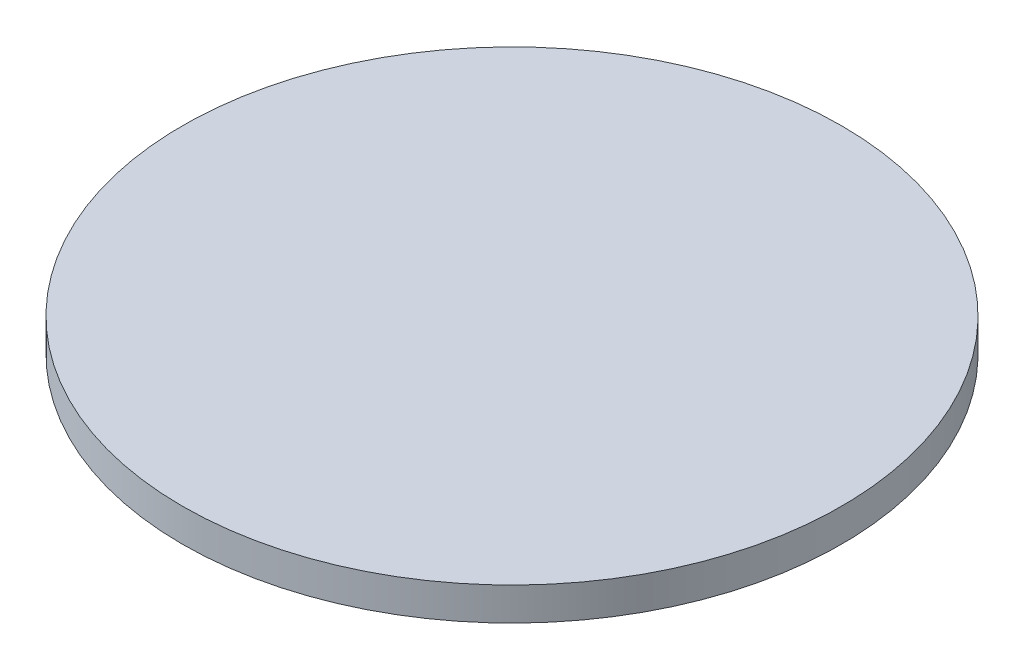
ISO-10303-21;
HEADER;
FILE_DESCRIPTION(('STEP AP214'),'2;1');
FILE_NAME('part.step','',(''),(''),'','','');
FILE_SCHEMA(('AUTOMOTIVE_DESIGN { 1 0 10303 214 1 1 1 1 }'));
ENDSEC;
DATA;
#1=APPLICATION_CONTEXT('core data for automotive mechanical design processes');
#2=APPLICATION_PROTOCOL_DEFINITION('international standard','automotive_design',2000,#1);
#3=PRODUCT_CONTEXT('',#1,'mechanical');
#4=PRODUCT('Part','Part','',(#3));
#5=PRODUCT_RELATED_PRODUCT_CATEGORY('part','',(#4));
#6=PRODUCT_DEFINITION_FORMATION('','',#4);
#7=PRODUCT_DEFINITION_CONTEXT('part definition',#1,'design');
#8=PRODUCT_DEFINITION('design','',#6,#7);
#9=PRODUCT_DEFINITION_SHAPE('','',#8);
#10=(LENGTH_UNIT() NAMED_UNIT(*) SI_UNIT(.MILLI.,.METRE.));
#11=(NAMED_UNIT(*) PLANE_ANGLE_UNIT() SI_UNIT($,.RADIAN.));
#12=(NAMED_UNIT(*) SI_UNIT($,.STERADIAN.) SOLID_ANGLE_UNIT());
#13=UNCERTAINTY_MEASURE_WITH_UNIT(LENGTH_MEASURE(1.E-05),#10,'distance_accuracy_value','');
#14=(GEOMETRIC_REPRESENTATION_CONTEXT(3) GLOBAL_UNCERTAINTY_ASSIGNED_CONTEXT((#13)) GLOBAL_UNIT_ASSIGNED_CONTEXT((#10,
#11,#12)) REPRESENTATION_CONTEXT('',''));
#15=CARTESIAN_POINT('',(0.,0.,0.));
#16=DIRECTION('',(0.,0.,1.));
#17=DIRECTION('',(1.,0.,0.));
#18=AXIS2_PLACEMENT_3D('',#15,#16,#17);
#19=CARTESIAN_POINT('',(0.,3.,0.));
#20=DIRECTION('',(0.,-1.,0.));
#21=DIRECTION('',(0.,0.,-1.));
#22=AXIS2_PLACEMENT_3D('',#19,#20,#21);
#23=CYLINDRICAL_SURFACE('',#22,30.);
#24=CARTESIAN_POINT('',(0.,3.,0.));
#25=DIRECTION('',(0.,1.,0.));
#26=DIRECTION('',(0.,0.,1.));
#27=AXIS2_PLACEMENT_3D('',#24,#25,#26);
#28=CIRCLE('',#27,30.);
#29=CARTESIAN_POINT('',(0.,3.,30.));
#30=VERTEX_POINT('',#29);
#31=EDGE_CURVE('E10',#30,#30,#28,.T.);
#32=ORIENTED_EDGE('',*,*,#31,.F.);
#33=EDGE_LOOP('',(#32));
#34=FACE_BOUND('',#33,.T.);
#35=CARTESIAN_POINT('',(0.,0.,0.));
#36=DIRECTION('',(0.,1.,0.));
#37=DIRECTION('',(0.,0.,1.));
#38=AXIS2_PLACEMENT_3D('',#35,#36,#37);
#39=CIRCLE('',#38,30.);
#40=CARTESIAN_POINT('',(0.,0.,30.));
#41=VERTEX_POINT('',#40);
#42=EDGE_CURVE('E40',#41,#41,#39,.T.);
#43=ORIENTED_EDGE('',*,*,#42,.T.);
#44=EDGE_LOOP('',(#43));
#45=FACE_BOUND('',#44,.T.);
#46=ADVANCED_FACE('F37',(#34,#45),#23,.T.);
#47=CARTESIAN_POINT('',(0.,3.,0.));
#48=DIRECTION('',(0.,1.,0.));
#49=DIRECTION('',(0.,0.,1.));
#50=AXIS2_PLACEMENT_3D('',#47,#48,#49);
#51=PLANE('',#50);
#52=ORIENTED_EDGE('',*,*,#31,.T.);
#53=EDGE_LOOP('',(#52));
#54=FACE_BOUND('',#53,.T.);
#55=ADVANCED_FACE('F52',(#54),#51,.T.);
#56=CARTESIAN_POINT('',(0.,0.,0.));
#57=DIRECTION('',(0.,1.,0.));
#58=DIRECTION('',(0.,0.,1.));
#59=AXIS2_PLACEMENT_3D('',#56,#57,#58);
#60=PLANE('',#59);
#61=ORIENTED_EDGE('',*,*,#42,.F.);
#62=EDGE_LOOP('',(#61));
#63=FACE_BOUND('',#62,.T.);
#64=ADVANCED_FACE('F50',(#63),#60,.F.);
#65=CLOSED_SHELL('',(#46,#55,#64));
#66=MANIFOLD_SOLID_BREP('B2',#65);
#67=ADVANCED_BREP_SHAPE_REPRESENTATION('',(#18,#66),#14);
#68=SHAPE_DEFINITION_REPRESENTATION(#9,#67);
ENDSEC;
END-ISO-10303-21;
